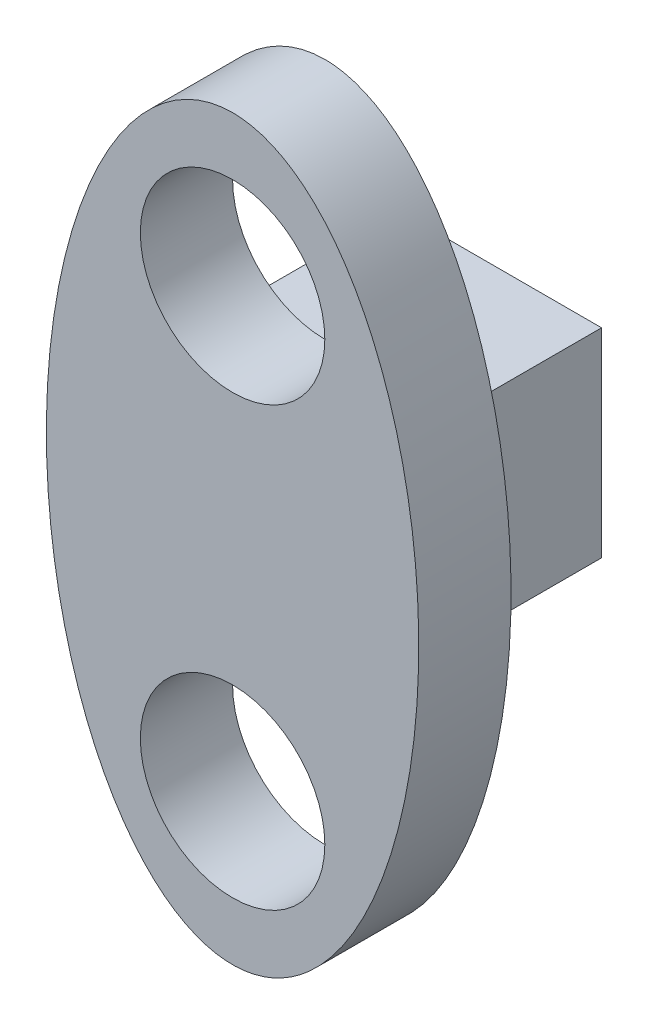
ISO-10303-21;
HEADER;
FILE_DESCRIPTION(('STEP AP214'),'2;1');
FILE_NAME('part.step','',(''),(''),'','','');
FILE_SCHEMA(('AUTOMOTIVE_DESIGN { 1 0 10303 214 1 1 1 1 }'));
ENDSEC;
DATA;
#1=APPLICATION_CONTEXT('core data for automotive mechanical design processes');
#2=APPLICATION_PROTOCOL_DEFINITION('international standard','automotive_design',2000,#1);
#3=PRODUCT_CONTEXT('',#1,'mechanical');
#4=PRODUCT('Part','Part','',(#3));
#5=PRODUCT_RELATED_PRODUCT_CATEGORY('part','',(#4));
#6=PRODUCT_DEFINITION_FORMATION('','',#4);
#7=PRODUCT_DEFINITION_CONTEXT('part definition',#1,'design');
#8=PRODUCT_DEFINITION('design','',#6,#7);
#9=PRODUCT_DEFINITION_SHAPE('','',#8);
#10=(LENGTH_UNIT() NAMED_UNIT(*) SI_UNIT(.MILLI.,.METRE.));
#11=(NAMED_UNIT(*) PLANE_ANGLE_UNIT() SI_UNIT($,.RADIAN.));
#12=(NAMED_UNIT(*) SI_UNIT($,.STERADIAN.) SOLID_ANGLE_UNIT());
#13=UNCERTAINTY_MEASURE_WITH_UNIT(LENGTH_MEASURE(1.E-05),#10,'distance_accuracy_value','');
#14=(GEOMETRIC_REPRESENTATION_CONTEXT(3) GLOBAL_UNCERTAINTY_ASSIGNED_CONTEXT((#13)) GLOBAL_UNIT_ASSIGNED_CONTEXT((#10,
#11,#12)) REPRESENTATION_CONTEXT('',''));
#15=CARTESIAN_POINT('',(0.,0.,0.));
#16=DIRECTION('',(0.,0.,1.));
#17=DIRECTION('',(1.,0.,0.));
#18=AXIS2_PLACEMENT_3D('',#15,#16,#17);
#19=CARTESIAN_POINT('',(-2.7,2.75,4.7));
#20=DIRECTION('',(1.,0.,0.));
#21=DIRECTION('',(0.,1.,0.));
#22=AXIS2_PLACEMENT_3D('',#19,#20,#21);
#23=PLANE('',#22);
#24=CARTESIAN_POINT('',(-2.7,-3.15,4.2));
#25=DIRECTION('',(1.,0.,0.));
#26=DIRECTION('',(0.,1.,0.));
#27=AXIS2_PLACEMENT_3D('',#24,#25,#26);
#28=CIRCLE('',#27,0.5);
#29=CARTESIAN_POINT('',(-2.7,-2.65,4.2));
#30=VERTEX_POINT('',#29);
#31=CARTESIAN_POINT('',(-2.7,-2.67303039929153,4.35));
#32=VERTEX_POINT('',#31);
#33=EDGE_CURVE('E166',#30,#32,#28,.T.);
#34=ORIENTED_EDGE('',*,*,#33,.T.);
#35=DIRECTION('',(0.,-1.,0.));
#36=VECTOR('',#35,1.);
#37=CARTESIAN_POINT('',(-2.7,2.75,4.35));
#38=LINE('',#37,#36);
#39=CARTESIAN_POINT('',(-2.7,2.77303039929153,4.35));
#40=VERTEX_POINT('',#39);
#41=EDGE_CURVE('E64',#32,#40,#38,.F.);
#42=ORIENTED_EDGE('',*,*,#41,.T.);
#43=CARTESIAN_POINT('',(-2.7,3.25,4.2));
#44=DIRECTION('',(1.,0.,0.));
#45=DIRECTION('',(0.,1.,0.));
#46=AXIS2_PLACEMENT_3D('',#43,#44,#45);
#47=CIRCLE('',#46,0.5);
#48=CARTESIAN_POINT('',(-2.7,2.75,4.2));
#49=VERTEX_POINT('',#48);
#50=EDGE_CURVE('E49',#40,#49,#47,.T.);
#51=ORIENTED_EDGE('',*,*,#50,.T.);
#52=DIRECTION('',(0.,0.,-1.));
#53=VECTOR('',#52,1.);
#54=CARTESIAN_POINT('',(-2.7,2.75,4.7));
#55=LINE('',#54,#53);
#56=CARTESIAN_POINT('',(-2.7,2.75,0.));
#57=VERTEX_POINT('',#56);
#58=EDGE_CURVE('E129',#49,#57,#55,.T.);
#59=ORIENTED_EDGE('',*,*,#58,.T.);
#60=DIRECTION('',(0.,-1.,0.));
#61=VECTOR('',#60,1.);
#62=CARTESIAN_POINT('',(-2.7,2.75,0.));
#63=LINE('',#62,#61);
#64=CARTESIAN_POINT('',(-2.7,-2.65,0.));
#65=VERTEX_POINT('',#64);
#66=EDGE_CURVE('E124',#57,#65,#63,.T.);
#67=ORIENTED_EDGE('',*,*,#66,.T.);
#68=DIRECTION('',(0.,0.,-1.));
#69=VECTOR('',#68,1.);
#70=CARTESIAN_POINT('',(-2.7,-2.65,4.7));
#71=LINE('',#70,#69);
#72=EDGE_CURVE('E108',#30,#65,#71,.T.);
#73=ORIENTED_EDGE('',*,*,#72,.F.);
#74=EDGE_LOOP('',(#34,#42,#51,#59,#67,#73));
#75=FACE_BOUND('',#74,.T.);
#76=ADVANCED_FACE('F35',(#75),#23,.F.);
#77=CARTESIAN_POINT('',(-2.7,-2.65,4.7));
#78=DIRECTION('',(0.,1.,0.));
#79=DIRECTION('',(0.,0.,1.));
#80=AXIS2_PLACEMENT_3D('',#77,#78,#79);
#81=PLANE('',#80);
#82=DIRECTION('',(0.,0.,-1.));
#83=VECTOR('',#82,1.);
#84=CARTESIAN_POINT('',(2.8,-2.65,4.7));
#85=LINE('',#84,#83);
#86=CARTESIAN_POINT('',(2.8,-2.65,4.2));
#87=VERTEX_POINT('',#86);
#88=CARTESIAN_POINT('',(2.8,-2.65,0.));
#89=VERTEX_POINT('',#88);
#90=EDGE_CURVE('E118',#87,#89,#85,.T.);
#91=ORIENTED_EDGE('',*,*,#90,.F.);
#92=DIRECTION('',(1.,0.,0.));
#93=VECTOR('',#92,1.);
#94=CARTESIAN_POINT('',(-2.7,-2.65,4.2));
#95=LINE('',#94,#93);
#96=EDGE_CURVE('E115',#87,#30,#95,.F.);
#97=ORIENTED_EDGE('',*,*,#96,.T.);
#98=ORIENTED_EDGE('',*,*,#72,.T.);
#99=DIRECTION('',(1.,0.,0.));
#100=VECTOR('',#99,1.);
#101=CARTESIAN_POINT('',(-2.7,-2.65,0.));
#102=LINE('',#101,#100);
#103=EDGE_CURVE('E112',#65,#89,#102,.T.);
#104=ORIENTED_EDGE('',*,*,#103,.T.);
#105=EDGE_LOOP('',(#91,#97,#98,#104));
#106=FACE_BOUND('',#105,.T.);
#107=ADVANCED_FACE('F111',(#106),#81,.F.);
#108=CARTESIAN_POINT('',(2.8,2.75,4.7));
#109=DIRECTION('',(-1.,0.,0.));
#110=DIRECTION('',(0.,-1.,0.));
#111=AXIS2_PLACEMENT_3D('',#108,#109,#110);
#112=PLANE('',#111);
#113=CARTESIAN_POINT('',(2.8,3.25,4.2));
#114=DIRECTION('',(-1.,0.,0.));
#115=DIRECTION('',(0.,-1.,0.));
#116=AXIS2_PLACEMENT_3D('',#113,#114,#115);
#117=CIRCLE('',#116,0.5);
#118=CARTESIAN_POINT('',(2.8,2.75,4.2));
#119=VERTEX_POINT('',#118);
#120=CARTESIAN_POINT('',(2.8,2.77303039929153,4.35));
#121=VERTEX_POINT('',#120);
#122=EDGE_CURVE('E12',#119,#121,#117,.T.);
#123=ORIENTED_EDGE('',*,*,#122,.T.);
#124=DIRECTION('',(0.,1.,0.));
#125=VECTOR('',#124,1.);
#126=CARTESIAN_POINT('',(2.8,-2.65,4.35));
#127=LINE('',#126,#125);
#128=CARTESIAN_POINT('',(2.8,-2.67303039929153,4.35));
#129=VERTEX_POINT('',#128);
#130=EDGE_CURVE('E57',#121,#129,#127,.F.);
#131=ORIENTED_EDGE('',*,*,#130,.T.);
#132=CARTESIAN_POINT('',(2.8,-3.15,4.2));
#133=DIRECTION('',(-1.,0.,0.));
#134=DIRECTION('',(0.,-1.,0.));
#135=AXIS2_PLACEMENT_3D('',#132,#133,#134);
#136=CIRCLE('',#135,0.5);
#137=EDGE_CURVE('E164',#129,#87,#136,.T.);
#138=ORIENTED_EDGE('',*,*,#137,.T.);
#139=ORIENTED_EDGE('',*,*,#90,.T.);
#140=DIRECTION('',(0.,1.,0.));
#141=VECTOR('',#140,1.);
#142=CARTESIAN_POINT('',(2.8,2.75,0.));
#143=LINE('',#142,#141);
#144=CARTESIAN_POINT('',(2.8,2.75,0.));
#145=VERTEX_POINT('',#144);
#146=EDGE_CURVE('E126',#89,#145,#143,.T.);
#147=ORIENTED_EDGE('',*,*,#146,.T.);
#148=DIRECTION('',(0.,0.,-1.));
#149=VECTOR('',#148,1.);
#150=CARTESIAN_POINT('',(2.8,2.75,4.7));
#151=LINE('',#150,#149);
#152=EDGE_CURVE('E142',#119,#145,#151,.T.);
#153=ORIENTED_EDGE('',*,*,#152,.F.);
#154=EDGE_LOOP('',(#123,#131,#138,#139,#147,#153));
#155=FACE_BOUND('',#154,.T.);
#156=ADVANCED_FACE('F215',(#155),#112,.F.);
#157=CARTESIAN_POINT('',(-2.7,2.75,4.7));
#158=DIRECTION('',(0.,-1.,0.));
#159=DIRECTION('',(0.,0.,-1.));
#160=AXIS2_PLACEMENT_3D('',#157,#158,#159);
#161=PLANE('',#160);
#162=ORIENTED_EDGE('',*,*,#58,.F.);
#163=DIRECTION('',(-1.,0.,0.));
#164=VECTOR('',#163,1.);
#165=CARTESIAN_POINT('',(2.8,2.75,4.2));
#166=LINE('',#165,#164);
#167=EDGE_CURVE('E154',#49,#119,#166,.F.);
#168=ORIENTED_EDGE('',*,*,#167,.T.);
#169=ORIENTED_EDGE('',*,*,#152,.T.);
#170=DIRECTION('',(-1.,0.,0.));
#171=VECTOR('',#170,1.);
#172=CARTESIAN_POINT('',(-2.7,2.75,0.));
#173=LINE('',#172,#171);
#174=EDGE_CURVE('E139',#145,#57,#173,.T.);
#175=ORIENTED_EDGE('',*,*,#174,.T.);
#176=EDGE_LOOP('',(#162,#168,#169,#175));
#177=FACE_BOUND('',#176,.T.);
#178=ADVANCED_FACE('F220',(#177),#161,.F.);
#179=CARTESIAN_POINT('',(0.,0.,0.));
#180=DIRECTION('',(0.,0.,1.));
#181=DIRECTION('',(1.,0.,0.));
#182=AXIS2_PLACEMENT_3D('',#179,#180,#181);
#183=PLANE('',#182);
#184=CARTESIAN_POINT('',(0.,0.,0.));
#185=DIRECTION('',(0.,0.,-1.));
#186=DIRECTION('',(-1.,0.,0.));
#187=AXIS2_PLACEMENT_3D('',#184,#185,#186);
#188=CIRCLE('',#187,2.05);
#189=CARTESIAN_POINT('',(-2.05,0.,0.));
#190=VERTEX_POINT('',#189);
#191=EDGE_CURVE('E248',#190,#190,#188,.T.);
#192=ORIENTED_EDGE('',*,*,#191,.F.);
#193=EDGE_LOOP('',(#192));
#194=FACE_BOUND('',#193,.T.);
#195=ORIENTED_EDGE('',*,*,#66,.F.);
#196=ORIENTED_EDGE('',*,*,#174,.F.);
#197=ORIENTED_EDGE('',*,*,#146,.F.);
#198=ORIENTED_EDGE('',*,*,#103,.F.);
#199=EDGE_LOOP('',(#195,#196,#197,#198));
#200=FACE_BOUND('',#199,.T.);
#201=ADVANCED_FACE('F122',(#194,#200),#183,.F.);
#202=CARTESIAN_POINT('',(0.,0.,4.7));
#203=DIRECTION('',(0.,0.,1.));
#204=DIRECTION('',(1.,0.,0.));
#205=AXIS2_PLACEMENT_3D('',#202,#203,#204);
#206=PLANE('',#205);
#207=DIRECTION('',(-1.,0.,0.));
#208=VECTOR('',#207,1.);
#209=CARTESIAN_POINT('',(-2.7,3.25,4.7));
#210=LINE('',#209,#208);
#211=CARTESIAN_POINT('',(3.15,3.25,4.7));
#212=VERTEX_POINT('',#211);
#213=CARTESIAN_POINT('',(-3.05,3.25,4.7));
#214=VERTEX_POINT('',#213);
#215=EDGE_CURVE('E146',#212,#214,#210,.T.);
#216=ORIENTED_EDGE('',*,*,#215,.T.);
#217=DIRECTION('',(0.,-1.,0.));
#218=VECTOR('',#217,1.);
#219=CARTESIAN_POINT('',(-3.05,-2.65,4.7));
#220=LINE('',#219,#218);
#221=CARTESIAN_POINT('',(-3.05,-3.15,4.7));
#222=VERTEX_POINT('',#221);
#223=EDGE_CURVE('E151',#214,#222,#220,.T.);
#224=ORIENTED_EDGE('',*,*,#223,.T.);
#225=DIRECTION('',(1.,0.,0.));
#226=VECTOR('',#225,1.);
#227=CARTESIAN_POINT('',(2.8,-3.15,4.7));
#228=LINE('',#227,#226);
#229=CARTESIAN_POINT('',(3.15,-3.15,4.7));
#230=VERTEX_POINT('',#229);
#231=EDGE_CURVE('E148',#222,#230,#228,.T.);
#232=ORIENTED_EDGE('',*,*,#231,.T.);
#233=DIRECTION('',(0.,1.,0.));
#234=VECTOR('',#233,1.);
#235=CARTESIAN_POINT('',(3.15,2.75,4.7));
#236=LINE('',#235,#234);
#237=EDGE_CURVE('E117',#230,#212,#236,.T.);
#238=ORIENTED_EDGE('',*,*,#237,.T.);
#239=EDGE_LOOP('',(#216,#224,#232,#238));
#240=FACE_BOUND('',#239,.T.);
#241=CARTESIAN_POINT('',(0.,0.,4.7));
#242=DIRECTION('',(0.,0.,1.));
#243=DIRECTION('',(0.,1.,0.));
#244=AXIS2_PLACEMENT_3D('',#241,#242,#243);
#245=ELLIPSE('',#244,10.,5.04615558570899);
#246=CARTESIAN_POINT('',(0.,10.,4.7));
#247=VERTEX_POINT('',#246);
#248=EDGE_CURVE('E134',#247,#247,#245,.T.);
#249=ORIENTED_EDGE('',*,*,#248,.F.);
#250=EDGE_LOOP('',(#249));
#251=FACE_BOUND('',#250,.T.);
#252=CARTESIAN_POINT('',(0.,5.93,4.7));
#253=DIRECTION('',(0.,0.,1.));
#254=DIRECTION('',(1.,0.,0.));
#255=AXIS2_PLACEMENT_3D('',#252,#253,#254);
#256=CIRCLE('',#255,2.5);
#257=CARTESIAN_POINT('',(2.5,5.93,4.7));
#258=VERTEX_POINT('',#257);
#259=EDGE_CURVE('E238',#258,#258,#256,.T.);
#260=ORIENTED_EDGE('',*,*,#259,.T.);
#261=EDGE_LOOP('',(#260));
#262=FACE_BOUND('',#261,.T.);
#263=CARTESIAN_POINT('',(0.,-5.93,4.7));
#264=DIRECTION('',(0.,0.,1.));
#265=DIRECTION('',(1.,0.,0.));
#266=AXIS2_PLACEMENT_3D('',#263,#264,#265);
#267=CIRCLE('',#266,2.5);
#268=CARTESIAN_POINT('',(2.5,-5.93,4.7));
#269=VERTEX_POINT('',#268);
#270=EDGE_CURVE('E245',#269,#269,#267,.T.);
#271=ORIENTED_EDGE('',*,*,#270,.T.);
#272=EDGE_LOOP('',(#271));
#273=FACE_BOUND('',#272,.T.);
#274=ADVANCED_FACE('F227',(#240,#251,#262,#273),#206,.F.);
#275=CARTESIAN_POINT('',(0.,0.,7.2));
#276=DIRECTION('',(0.,0.,1.));
#277=DIRECTION('',(1.,0.,0.));
#278=AXIS2_PLACEMENT_3D('',#275,#276,#277);
#279=PLANE('',#278);
#280=CARTESIAN_POINT('',(0.,5.93,7.2));
#281=DIRECTION('',(0.,0.,1.));
#282=DIRECTION('',(1.,0.,0.));
#283=AXIS2_PLACEMENT_3D('',#280,#281,#282);
#284=CIRCLE('',#283,2.5);
#285=CARTESIAN_POINT('',(2.5,5.93,7.2));
#286=VERTEX_POINT('',#285);
#287=EDGE_CURVE('E241',#286,#286,#284,.T.);
#288=ORIENTED_EDGE('',*,*,#287,.F.);
#289=EDGE_LOOP('',(#288));
#290=FACE_BOUND('',#289,.T.);
#291=CARTESIAN_POINT('',(0.,0.,7.2));
#292=DIRECTION('',(0.,0.,1.));
#293=DIRECTION('',(0.,1.,0.));
#294=AXIS2_PLACEMENT_3D('',#291,#292,#293);
#295=ELLIPSE('',#294,10.,5.04615558570899);
#296=CARTESIAN_POINT('',(0.,10.,7.2));
#297=VERTEX_POINT('',#296);
#298=EDGE_CURVE('E131',#297,#297,#295,.T.);
#299=ORIENTED_EDGE('',*,*,#298,.T.);
#300=EDGE_LOOP('',(#299));
#301=FACE_BOUND('',#300,.T.);
#302=CARTESIAN_POINT('',(0.,-5.93,7.2));
#303=DIRECTION('',(0.,0.,1.));
#304=DIRECTION('',(1.,0.,0.));
#305=AXIS2_PLACEMENT_3D('',#302,#303,#304);
#306=CIRCLE('',#305,2.5);
#307=CARTESIAN_POINT('',(2.5,-5.93,7.2));
#308=VERTEX_POINT('',#307);
#309=EDGE_CURVE('E242',#308,#308,#306,.T.);
#310=ORIENTED_EDGE('',*,*,#309,.F.);
#311=EDGE_LOOP('',(#310));
#312=FACE_BOUND('',#311,.T.);
#313=ADVANCED_FACE('F233',(#290,#301,#312),#279,.T.);
#314=DIRECTION('',(0.,0.,-1.));
#315=VECTOR('',#314,1.);
#316=SURFACE_OF_LINEAR_EXTRUSION('',#295,#315);
#317=ORIENTED_EDGE('',*,*,#298,.F.);
#318=EDGE_LOOP('',(#317));
#319=FACE_BOUND('',#318,.T.);
#320=ORIENTED_EDGE('',*,*,#248,.T.);
#321=EDGE_LOOP('',(#320));
#322=FACE_BOUND('',#321,.T.);
#323=ADVANCED_FACE('F229',(#319,#322),#316,.F.);
#324=CARTESIAN_POINT('',(0.,5.93,7.2));
#325=DIRECTION('',(0.,0.,-1.));
#326=DIRECTION('',(-1.,0.,0.));
#327=AXIS2_PLACEMENT_3D('',#324,#325,#326);
#328=CYLINDRICAL_SURFACE('',#327,2.5);
#329=ORIENTED_EDGE('',*,*,#287,.T.);
#330=EDGE_LOOP('',(#329));
#331=FACE_BOUND('',#330,.T.);
#332=ORIENTED_EDGE('',*,*,#259,.F.);
#333=EDGE_LOOP('',(#332));
#334=FACE_BOUND('',#333,.T.);
#335=ADVANCED_FACE('F232',(#331,#334),#328,.F.);
#336=CARTESIAN_POINT('',(0.,-5.93,7.2));
#337=DIRECTION('',(0.,0.,-1.));
#338=DIRECTION('',(-1.,0.,0.));
#339=AXIS2_PLACEMENT_3D('',#336,#337,#338);
#340=CYLINDRICAL_SURFACE('',#339,2.5);
#341=ORIENTED_EDGE('',*,*,#309,.T.);
#342=EDGE_LOOP('',(#341));
#343=FACE_BOUND('',#342,.T.);
#344=ORIENTED_EDGE('',*,*,#270,.F.);
#345=EDGE_LOOP('',(#344));
#346=FACE_BOUND('',#345,.T.);
#347=ADVANCED_FACE('F277',(#343,#346),#340,.F.);
#348=CARTESIAN_POINT('',(0.,0.,4.32));
#349=DIRECTION('',(0.,0.,-1.));
#350=DIRECTION('',(-1.,0.,0.));
#351=AXIS2_PLACEMENT_3D('',#348,#349,#350);
#352=CYLINDRICAL_SURFACE('',#351,2.05);
#353=CARTESIAN_POINT('',(0.,0.,4.12));
#354=DIRECTION('',(0.,0.,-1.));
#355=DIRECTION('',(-1.,0.,0.));
#356=AXIS2_PLACEMENT_3D('',#353,#354,#355);
#357=CIRCLE('',#356,2.05);
#358=CARTESIAN_POINT('',(-2.05,0.,4.12));
#359=VERTEX_POINT('',#358);
#360=EDGE_CURVE('E161',#359,#359,#357,.F.);
#361=ORIENTED_EDGE('',*,*,#360,.T.);
#362=EDGE_LOOP('',(#361));
#363=FACE_BOUND('',#362,.T.);
#364=ORIENTED_EDGE('',*,*,#191,.T.);
#365=EDGE_LOOP('',(#364));
#366=FACE_BOUND('',#365,.T.);
#367=ADVANCED_FACE('F207',(#363,#366),#352,.F.);
#368=CARTESIAN_POINT('',(0.,0.,4.32));
#369=DIRECTION('',(0.,0.,-1.));
#370=DIRECTION('',(-1.,0.,0.));
#371=AXIS2_PLACEMENT_3D('',#368,#369,#370);
#372=PLANE('',#371);
#373=CARTESIAN_POINT('',(0.,0.,4.32));
#374=DIRECTION('',(0.,0.,-1.));
#375=DIRECTION('',(-1.,0.,0.));
#376=AXIS2_PLACEMENT_3D('',#373,#374,#375);
#377=CIRCLE('',#376,1.85);
#378=CARTESIAN_POINT('',(-1.85,0.,4.32));
#379=VERTEX_POINT('',#378);
#380=EDGE_CURVE('E158',#379,#379,#377,.T.);
#381=ORIENTED_EDGE('',*,*,#380,.T.);
#382=EDGE_LOOP('',(#381));
#383=FACE_BOUND('',#382,.T.);
#384=ADVANCED_FACE('F199',(#383),#372,.T.);
#385=CARTESIAN_POINT('',(0.,3.25,4.2));
#386=DIRECTION('',(1.,0.,0.));
#387=DIRECTION('',(0.,0.,-1.));
#388=AXIS2_PLACEMENT_3D('',#385,#386,#387);
#389=CYLINDRICAL_SURFACE('',#388,0.5);
#390=ORIENTED_EDGE('',*,*,#167,.F.);
#391=ORIENTED_EDGE('',*,*,#50,.F.);
#392=CARTESIAN_POINT('',(-2.7,2.77303039929153,4.35));
#393=CARTESIAN_POINT('',(-2.69998747116909,2.7790698808414,4.36929349809213));
#394=CARTESIAN_POINT('',(-2.70159147839322,2.78630116209024,4.38811782989365));
#395=CARTESIAN_POINT('',(-2.70748759571846,2.80268499936472,4.42425817016551));
#396=CARTESIAN_POINT('',(-2.71175392204331,2.81181857337969,4.44158685197222));
#397=CARTESIAN_POINT('',(-2.72242197105287,2.83162387991141,4.4744646454522));
#398=CARTESIAN_POINT('',(-2.72881267412762,2.84228751668791,4.4900223955429));
#399=CARTESIAN_POINT('',(-2.7432847613265,2.8648619790921,4.51939378308666));
#400=CARTESIAN_POINT('',(-2.75137071075773,2.87677612818692,4.53320254605918));
#401=CARTESIAN_POINT('',(-2.77408447171465,2.90898338964242,4.56678038491591));
#402=CARTESIAN_POINT('',(-2.78972715505011,2.93001609003226,4.58515683168033));
#403=CARTESIAN_POINT('',(-2.82318212281998,2.97364819423414,4.61757832239264));
#404=CARTESIAN_POINT('',(-2.84099985670834,2.9962514694246,4.63161216219588));
#405=CARTESIAN_POINT('',(-2.88454927861307,3.05059317975388,4.65986682391326));
#406=CARTESIAN_POINT('',(-2.91085596012851,3.0827421210103,4.67240828123218));
#407=CARTESIAN_POINT('',(-2.96465047192024,3.14784715025678,4.69061708910193));
#408=CARTESIAN_POINT('',(-2.99213632015397,3.18080184662682,4.69629554032223));
#409=CARTESIAN_POINT('',(-3.02886431428304,3.22473698983484,4.69948074983211));
#410=CARTESIAN_POINT('',(-3.03799639505569,3.23565284999987,4.69991333225893));
#411=CARTESIAN_POINT('',(-3.04808684066177,3.24771333793113,4.69999607941741));
#412=CARTESIAN_POINT('',(-3.04904341711568,3.24885666554311,4.70000000083256));
#413=CARTESIAN_POINT('',(-3.05,3.25,4.7));
#414=B_SPLINE_CURVE_WITH_KNOTS('',3,(#392,#393,#394,#395,#396,#397,#398,#399,#400,#401,#402,
#403,#404,#405,#406,#407,#408,#409,#410,#411,#412,#413),.UNSPECIFIED.,.F.,.F.,(4,2,2,2,2,2,2,2,
2,2,4),(0.,0.0604143854375106,0.120252566711431,0.179785075612359,0.239480013958899,
0.334978758631179,0.430721879132246,0.560229078607656,0.68952652322543,0.732229833964935,
0.736701985394859),.UNSPECIFIED.);
#415=EDGE_CURVE('E39',#214,#40,#414,.F.);
#416=ORIENTED_EDGE('',*,*,#415,.F.);
#417=ORIENTED_EDGE('',*,*,#215,.F.);
#418=CARTESIAN_POINT('',(2.8,2.77303039929153,4.35));
#419=CARTESIAN_POINT('',(2.79998747116909,2.7790698808414,4.36929349809213));
#420=CARTESIAN_POINT('',(2.80159147839321,2.78630116209024,4.38811782989365));
#421=CARTESIAN_POINT('',(2.80748759571846,2.80268499936472,4.42425817016551));
#422=CARTESIAN_POINT('',(2.81175392204331,2.81181857337969,4.44158685197222));
#423=CARTESIAN_POINT('',(2.82242197105287,2.83162387991141,4.4744646454522));
#424=CARTESIAN_POINT('',(2.82881267412761,2.84228751668791,4.4900223955429));
#425=CARTESIAN_POINT('',(2.8432847613265,2.8648619790921,4.51939378308666));
#426=CARTESIAN_POINT('',(2.85137071075773,2.87677612818692,4.53320254605918));
#427=CARTESIAN_POINT('',(2.87408447171464,2.90898338964242,4.56678038491591));
#428=CARTESIAN_POINT('',(2.88972715505011,2.93001609003226,4.58515683168033));
#429=CARTESIAN_POINT('',(2.92318212281997,2.97364819423414,4.61757832239264));
#430=CARTESIAN_POINT('',(2.94099985670833,2.9962514694246,4.63161216219589));
#431=CARTESIAN_POINT('',(2.98454927861307,3.05059317975388,4.65986682391327));
#432=CARTESIAN_POINT('',(3.01085596012851,3.0827421210103,4.67240828123218));
#433=CARTESIAN_POINT('',(3.06465047192024,3.14784715025678,4.69061708910193));
#434=CARTESIAN_POINT('',(3.09213632015396,3.18080184662682,4.69629554032223));
#435=CARTESIAN_POINT('',(3.12886431428304,3.22473698983484,4.69948074983211));
#436=CARTESIAN_POINT('',(3.13799639505569,3.23565284999987,4.69991333225893));
#437=CARTESIAN_POINT('',(3.14808684066177,3.24771333793113,4.69999607941741));
#438=CARTESIAN_POINT('',(3.14904341711568,3.24885666554311,4.70000000083256));
#439=CARTESIAN_POINT('',(3.15,3.25,4.7));
#440=B_SPLINE_CURVE_WITH_KNOTS('',3,(#418,#419,#420,#421,#422,#423,#424,#425,#426,#427,#428,
#429,#430,#431,#432,#433,#434,#435,#436,#437,#438,#439),.UNSPECIFIED.,.F.,.F.,(4,2,2,2,2,2,2,2,
2,2,4),(0.,0.0604143854375106,0.120252566711431,0.179785075612359,0.239480013958899,
0.33497875863118,0.430721879132247,0.560229078607656,0.689526523225431,0.732229833964935,
0.736701985394859),.UNSPECIFIED.);
#441=EDGE_CURVE('E191',#121,#212,#440,.T.);
#442=ORIENTED_EDGE('',*,*,#441,.F.);
#443=ORIENTED_EDGE('',*,*,#122,.F.);
#444=EDGE_LOOP('',(#390,#391,#416,#417,#442,#443));
#445=FACE_BOUND('',#444,.T.);
#446=ADVANCED_FACE('F196',(#445),#389,.F.);
#447=CARTESIAN_POINT('',(-3.05,0.,4.35));
#448=DIRECTION('',(0.,1.,0.));
#449=DIRECTION('',(-1.,0.,0.));
#450=AXIS2_PLACEMENT_3D('',#447,#448,#449);
#451=CYLINDRICAL_SURFACE('',#450,0.35);
#452=ORIENTED_EDGE('',*,*,#41,.F.);
#453=CARTESIAN_POINT('',(-2.7,-2.67303039929153,4.35));
#454=CARTESIAN_POINT('',(-2.69998747116909,-2.6790698808414,4.36929349809213));
#455=CARTESIAN_POINT('',(-2.70159147839321,-2.68630116209024,4.38811782989365));
#456=CARTESIAN_POINT('',(-2.70748759571846,-2.70268499936472,4.42425817016551));
#457=CARTESIAN_POINT('',(-2.71175392204331,-2.7118185733797,4.44158685197222));
#458=CARTESIAN_POINT('',(-2.72242197105287,-2.73162387991141,4.4744646454522));
#459=CARTESIAN_POINT('',(-2.72881267412761,-2.74228751668791,4.4900223955429));
#460=CARTESIAN_POINT('',(-2.7432847613265,-2.7648619790921,4.51939378308666));
#461=CARTESIAN_POINT('',(-2.75137071075773,-2.77677612818692,4.53320254605918));
#462=CARTESIAN_POINT('',(-2.77408447171465,-2.80898338964242,4.56678038491591));
#463=CARTESIAN_POINT('',(-2.78972715505011,-2.83001609003226,4.58515683168033));
#464=CARTESIAN_POINT('',(-2.82318212281998,-2.87364819423414,4.61757832239264));
#465=CARTESIAN_POINT('',(-2.84099985670833,-2.8962514694246,4.63161216219589));
#466=CARTESIAN_POINT('',(-2.88454927861307,-2.95059317975388,4.65986682391327));
#467=CARTESIAN_POINT('',(-2.91085596012851,-2.9827421210103,4.67240828123218));
#468=CARTESIAN_POINT('',(-2.96465047192024,-3.04784715025678,4.69061708910193));
#469=CARTESIAN_POINT('',(-2.99213632015397,-3.08080184662682,4.69629554032223));
#470=CARTESIAN_POINT('',(-3.02886431428304,-3.12473698983484,4.69948074983211));
#471=CARTESIAN_POINT('',(-3.03799639505569,-3.13565284999987,4.69991333225893));
#472=CARTESIAN_POINT('',(-3.04808684066177,-3.14771333793113,4.69999607941741));
#473=CARTESIAN_POINT('',(-3.04904341711568,-3.14885666554311,4.70000000083256));
#474=CARTESIAN_POINT('',(-3.05,-3.15,4.7));
#475=B_SPLINE_CURVE_WITH_KNOTS('',3,(#453,#454,#455,#456,#457,#458,#459,#460,#461,#462,#463,
#464,#465,#466,#467,#468,#469,#470,#471,#472,#473,#474),.UNSPECIFIED.,.F.,.F.,(4,2,2,2,2,2,2,2,
2,2,4),(0.,0.0604143854375106,0.120252566711431,0.179785075612359,0.239480013958899,
0.33497875863118,0.430721879132247,0.560229078607657,0.68952652322543,0.732229833964935,
0.736701985394859),.UNSPECIFIED.);
#476=EDGE_CURVE('E177',#222,#32,#475,.F.);
#477=ORIENTED_EDGE('',*,*,#476,.F.);
#478=ORIENTED_EDGE('',*,*,#223,.F.);
#479=ORIENTED_EDGE('',*,*,#415,.T.);
#480=EDGE_LOOP('',(#452,#477,#478,#479));
#481=FACE_BOUND('',#480,.T.);
#482=ADVANCED_FACE('F188',(#481),#451,.F.);
#483=CARTESIAN_POINT('',(3.15,0.,4.35));
#484=DIRECTION('',(0.,-1.,0.));
#485=DIRECTION('',(1.,0.,0.));
#486=AXIS2_PLACEMENT_3D('',#483,#484,#485);
#487=CYLINDRICAL_SURFACE('',#486,0.35);
#488=ORIENTED_EDGE('',*,*,#441,.T.);
#489=ORIENTED_EDGE('',*,*,#237,.F.);
#490=CARTESIAN_POINT('',(2.8,-2.67303039929153,4.35));
#491=CARTESIAN_POINT('',(2.79998747116909,-2.6790698808414,4.36929349809213));
#492=CARTESIAN_POINT('',(2.80159147839321,-2.68630116209024,4.38811782989365));
#493=CARTESIAN_POINT('',(2.80748759571846,-2.70268499936472,4.42425817016551));
#494=CARTESIAN_POINT('',(2.81175392204331,-2.7118185733797,4.44158685197222));
#495=CARTESIAN_POINT('',(2.82242197105287,-2.73162387991142,4.4744646454522));
#496=CARTESIAN_POINT('',(2.82881267412761,-2.74228751668791,4.4900223955429));
#497=CARTESIAN_POINT('',(2.8432847613265,-2.76486197909211,4.51939378308666));
#498=CARTESIAN_POINT('',(2.85137071075773,-2.77677612818692,4.53320254605918));
#499=CARTESIAN_POINT('',(2.87408447171465,-2.80898338964242,4.56678038491591));
#500=CARTESIAN_POINT('',(2.88972715505011,-2.83001609003226,4.58515683168033));
#501=CARTESIAN_POINT('',(2.92318212281998,-2.87364819423414,4.61757832239264));
#502=CARTESIAN_POINT('',(2.94099985670834,-2.8962514694246,4.63161216219589));
#503=CARTESIAN_POINT('',(2.98454927861307,-2.95059317975389,4.65986682391327));
#504=CARTESIAN_POINT('',(3.01085596012851,-2.9827421210103,4.67240828123218));
#505=CARTESIAN_POINT('',(3.06465047192024,-3.04784715025678,4.69061708910193));
#506=CARTESIAN_POINT('',(3.09213632015398,-3.08080184662681,4.69629554032223));
#507=CARTESIAN_POINT('',(3.12886431428304,-3.12473698983485,4.69948074983211));
#508=CARTESIAN_POINT('',(3.13799639505568,-3.13565284999988,4.69991333225893));
#509=CARTESIAN_POINT('',(3.14808684066177,-3.14771333793113,4.69999607941741));
#510=CARTESIAN_POINT('',(3.14904341711568,-3.14885666554311,4.70000000083256));
#511=CARTESIAN_POINT('',(3.15,-3.15,4.7));
#512=B_SPLINE_CURVE_WITH_KNOTS('',3,(#490,#491,#492,#493,#494,#495,#496,#497,#498,#499,#500,
#501,#502,#503,#504,#505,#506,#507,#508,#509,#510,#511),.UNSPECIFIED.,.F.,.F.,(4,2,2,2,2,2,2,2,
2,2,4),(0.,0.0604143854375106,0.120252566711431,0.17978507561236,0.239480013958899,
0.33497875863118,0.430721879132247,0.560229078607656,0.689526523225431,0.732229833964935,
0.736701985394859),.UNSPECIFIED.);
#513=EDGE_CURVE('E169',#129,#230,#512,.T.);
#514=ORIENTED_EDGE('',*,*,#513,.F.);
#515=ORIENTED_EDGE('',*,*,#130,.F.);
#516=EDGE_LOOP('',(#488,#489,#514,#515));
#517=FACE_BOUND('',#516,.T.);
#518=ADVANCED_FACE('F185',(#517),#487,.F.);
#519=CARTESIAN_POINT('',(0.,-3.15,4.2));
#520=DIRECTION('',(-1.,0.,0.));
#521=DIRECTION('',(0.,0.,1.));
#522=AXIS2_PLACEMENT_3D('',#519,#520,#521);
#523=CYLINDRICAL_SURFACE('',#522,0.5);
#524=ORIENTED_EDGE('',*,*,#33,.F.);
#525=ORIENTED_EDGE('',*,*,#96,.F.);
#526=ORIENTED_EDGE('',*,*,#137,.F.);
#527=ORIENTED_EDGE('',*,*,#513,.T.);
#528=ORIENTED_EDGE('',*,*,#231,.F.);
#529=ORIENTED_EDGE('',*,*,#476,.T.);
#530=EDGE_LOOP('',(#524,#525,#526,#527,#528,#529));
#531=FACE_BOUND('',#530,.T.);
#532=ADVANCED_FACE('F182',(#531),#523,.F.);
#533=CARTESIAN_POINT('',(0.,0.,4.12));
#534=DIRECTION('',(0.,0.,-1.));
#535=DIRECTION('',(-1.,0.,0.));
#536=AXIS2_PLACEMENT_3D('',#533,#534,#535);
#537=TOROIDAL_SURFACE('',#536,1.85,0.2);
#538=ORIENTED_EDGE('',*,*,#360,.F.);
#539=EDGE_LOOP('',(#538));
#540=FACE_BOUND('',#539,.T.);
#541=ORIENTED_EDGE('',*,*,#380,.F.);
#542=EDGE_LOOP('',(#541));
#543=FACE_BOUND('',#542,.T.);
#544=ADVANCED_FACE('F37',(#540,#543),#537,.F.);
#545=CLOSED_SHELL('',(#76,#107,#156,#178,#201,#274,#313,#323,#335,#347,#367,#384,#446,#482,#518,
#532,#544));
#546=MANIFOLD_SOLID_BREP('B2',#545);
#547=ADVANCED_BREP_SHAPE_REPRESENTATION('',(#18,#546),#14);
#548=SHAPE_DEFINITION_REPRESENTATION(#9,#547);
ENDSEC;
END-ISO-10303-21;
